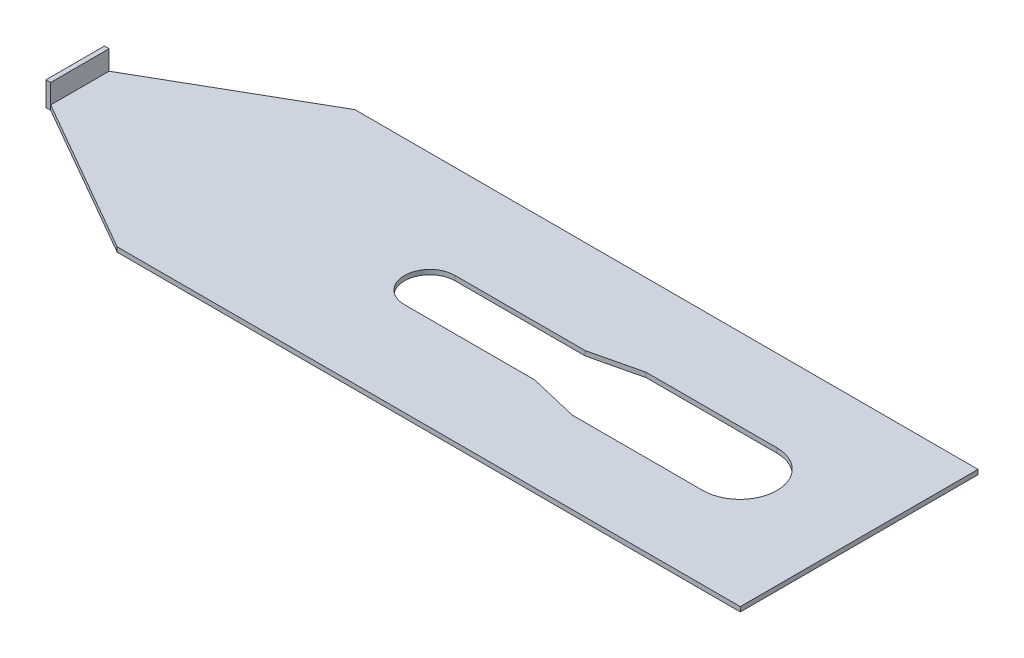
ISO-10303-21;
HEADER;
FILE_DESCRIPTION(('STEP AP214'),'2;1');
FILE_NAME('part.step','',(''),(''),'','','');
FILE_SCHEMA(('AUTOMOTIVE_DESIGN { 1 0 10303 214 1 1 1 1 }'));
ENDSEC;
DATA;
#1=APPLICATION_CONTEXT('core data for automotive mechanical design processes');
#2=APPLICATION_PROTOCOL_DEFINITION('international standard','automotive_design',2000,#1);
#3=PRODUCT_CONTEXT('',#1,'mechanical');
#4=PRODUCT('Part','Part','',(#3));
#5=PRODUCT_RELATED_PRODUCT_CATEGORY('part','',(#4));
#6=PRODUCT_DEFINITION_FORMATION('','',#4);
#7=PRODUCT_DEFINITION_CONTEXT('part definition',#1,'design');
#8=PRODUCT_DEFINITION('design','',#6,#7);
#9=PRODUCT_DEFINITION_SHAPE('','',#8);
#10=(LENGTH_UNIT() NAMED_UNIT(*) SI_UNIT(.MILLI.,.METRE.));
#11=(NAMED_UNIT(*) PLANE_ANGLE_UNIT() SI_UNIT($,.RADIAN.));
#12=(NAMED_UNIT(*) SI_UNIT($,.STERADIAN.) SOLID_ANGLE_UNIT());
#13=UNCERTAINTY_MEASURE_WITH_UNIT(LENGTH_MEASURE(1.E-05),#10,'distance_accuracy_value','');
#14=(GEOMETRIC_REPRESENTATION_CONTEXT(3) GLOBAL_UNCERTAINTY_ASSIGNED_CONTEXT((#13)) GLOBAL_UNIT_ASSIGNED_CONTEXT((#10,
#11,#12)) REPRESENTATION_CONTEXT('',''));
#15=CARTESIAN_POINT('',(0.,0.,0.));
#16=DIRECTION('',(0.,0.,1.));
#17=DIRECTION('',(1.,0.,0.));
#18=AXIS2_PLACEMENT_3D('',#15,#16,#17);
#19=CARTESIAN_POINT('',(0.,0.,4.826));
#20=DIRECTION('',(0.,-1.,0.));
#21=DIRECTION('',(0.,0.,-1.));
#22=AXIS2_PLACEMENT_3D('',#19,#20,#21);
#23=PLANE('',#22);
#24=DIRECTION('',(-1.,0.,0.));
#25=VECTOR('',#24,1.);
#26=CARTESIAN_POINT('',(0.0762,0.,4.826));
#27=LINE('',#26,#25);
#28=CARTESIAN_POINT('',(0.1524,0.,4.826));
#29=VERTEX_POINT('',#28);
#30=CARTESIAN_POINT('',(0.,0.,4.826));
#31=VERTEX_POINT('',#30);
#32=EDGE_CURVE('E187',#29,#31,#27,.T.);
#33=ORIENTED_EDGE('',*,*,#32,.F.);
#34=DIRECTION('',(0.,0.,-1.));
#35=VECTOR('',#34,1.);
#36=CARTESIAN_POINT('',(0.1524,0.,3.8735));
#37=LINE('',#36,#35);
#38=CARTESIAN_POINT('',(0.1524,0.,2.921));
#39=VERTEX_POINT('',#38);
#40=EDGE_CURVE('E77',#29,#39,#37,.T.);
#41=ORIENTED_EDGE('',*,*,#40,.T.);
#42=DIRECTION('',(-1.,0.,0.));
#43=VECTOR('',#42,1.);
#44=CARTESIAN_POINT('',(0.0762,0.,2.921));
#45=LINE('',#44,#43);
#46=CARTESIAN_POINT('',(0.,0.,2.921));
#47=VERTEX_POINT('',#46);
#48=EDGE_CURVE('E180',#39,#47,#45,.T.);
#49=ORIENTED_EDGE('',*,*,#48,.T.);
#50=DIRECTION('',(0.,0.,1.));
#51=VECTOR('',#50,1.);
#52=CARTESIAN_POINT('',(0.,0.,3.8735));
#53=LINE('',#52,#51);
#54=EDGE_CURVE('E173',#47,#31,#53,.T.);
#55=ORIENTED_EDGE('',*,*,#54,.T.);
#56=EDGE_LOOP('',(#33,#41,#49,#55));
#57=FACE_BOUND('',#56,.T.);
#58=ADVANCED_FACE('F16',(#57),#23,.F.);
#59=CARTESIAN_POINT('',(0.1524,0.,2.921));
#60=DIRECTION('',(-1.,0.,0.));
#61=DIRECTION('',(0.,-1.,0.));
#62=AXIS2_PLACEMENT_3D('',#59,#60,#61);
#63=PLANE('',#62);
#64=DIRECTION('',(0.,-1.,0.));
#65=VECTOR('',#64,1.);
#66=CARTESIAN_POINT('',(0.1524,-0.3937,4.826));
#67=LINE('',#66,#65);
#68=CARTESIAN_POINT('',(0.1524,-0.63500000001905,4.826));
#69=VERTEX_POINT('',#68);
#70=EDGE_CURVE('E172',#29,#69,#67,.T.);
#71=ORIENTED_EDGE('',*,*,#70,.T.);
#72=DIRECTION('',(0.,0.,-1.));
#73=VECTOR('',#72,1.);
#74=CARTESIAN_POINT('',(0.1524,-0.635,3.8735));
#75=LINE('',#74,#73);
#76=CARTESIAN_POINT('',(0.1524,-0.63500000001905,2.921));
#77=VERTEX_POINT('',#76);
#78=EDGE_CURVE('E198',#69,#77,#75,.T.);
#79=ORIENTED_EDGE('',*,*,#78,.T.);
#80=DIRECTION('',(0.,1.,0.));
#81=VECTOR('',#80,1.);
#82=CARTESIAN_POINT('',(0.1524,-0.3937,2.921));
#83=LINE('',#82,#81);
#84=EDGE_CURVE('E68',#77,#39,#83,.T.);
#85=ORIENTED_EDGE('',*,*,#84,.T.);
#86=ORIENTED_EDGE('',*,*,#40,.F.);
#87=EDGE_LOOP('',(#71,#79,#85,#86));
#88=FACE_BOUND('',#87,.T.);
#89=ADVANCED_FACE('F336',(#88),#63,.F.);
#90=CARTESIAN_POINT('',(25.5524,-0.7874,0.));
#91=DIRECTION('',(-1.,0.,0.));
#92=DIRECTION('',(0.,0.,1.));
#93=AXIS2_PLACEMENT_3D('',#90,#91,#92);
#94=PLANE('',#93);
#95=DIRECTION('',(0.,0.,1.));
#96=VECTOR('',#95,1.);
#97=CARTESIAN_POINT('',(25.5524,-0.635,3.8735));
#98=LINE('',#97,#96);
#99=CARTESIAN_POINT('',(25.5524,-0.635,0.));
#100=VERTEX_POINT('',#99);
#101=CARTESIAN_POINT('',(25.5524,-0.635,7.747));
#102=VERTEX_POINT('',#101);
#103=EDGE_CURVE('E151',#100,#102,#98,.T.);
#104=ORIENTED_EDGE('',*,*,#103,.T.);
#105=DIRECTION('',(0.,-1.,0.));
#106=VECTOR('',#105,1.);
#107=CARTESIAN_POINT('',(25.5524,-0.7112,7.747));
#108=LINE('',#107,#106);
#109=CARTESIAN_POINT('',(25.5524,-0.7874,7.747));
#110=VERTEX_POINT('',#109);
#111=EDGE_CURVE('E165',#102,#110,#108,.T.);
#112=ORIENTED_EDGE('',*,*,#111,.T.);
#113=DIRECTION('',(0.,0.,-1.));
#114=VECTOR('',#113,1.);
#115=CARTESIAN_POINT('',(25.5524,-0.7874,3.8735));
#116=LINE('',#115,#114);
#117=CARTESIAN_POINT('',(25.5524,-0.7874,0.));
#118=VERTEX_POINT('',#117);
#119=EDGE_CURVE('E221',#110,#118,#116,.T.);
#120=ORIENTED_EDGE('',*,*,#119,.T.);
#121=DIRECTION('',(0.,-1.,0.));
#122=VECTOR('',#121,1.);
#123=CARTESIAN_POINT('',(25.5524,-0.7112,0.));
#124=LINE('',#123,#122);
#125=EDGE_CURVE('E182',#100,#118,#124,.T.);
#126=ORIENTED_EDGE('',*,*,#125,.F.);
#127=EDGE_LOOP('',(#104,#112,#120,#126));
#128=FACE_BOUND('',#127,.T.);
#129=ADVANCED_FACE('F265',(#128),#94,.F.);
#130=CARTESIAN_POINT('',(25.5524,-0.7874,0.));
#131=DIRECTION('',(0.,0.,-1.));
#132=DIRECTION('',(-1.,0.,0.));
#133=AXIS2_PLACEMENT_3D('',#130,#131,#132);
#134=PLANE('',#133);
#135=ORIENTED_EDGE('',*,*,#125,.T.);
#136=DIRECTION('',(-1.,0.,0.));
#137=VECTOR('',#136,1.);
#138=CARTESIAN_POINT('',(12.7762,-0.7874,0.));
#139=LINE('',#138,#137);
#140=CARTESIAN_POINT('',(5.24102865940001,-0.7874,0.));
#141=VERTEX_POINT('',#140);
#142=EDGE_CURVE('E217',#118,#141,#139,.T.);
#143=ORIENTED_EDGE('',*,*,#142,.T.);
#144=DIRECTION('',(0.,1.,0.));
#145=VECTOR('',#144,1.);
#146=CARTESIAN_POINT('',(5.2410286594,-0.7112,0.));
#147=LINE('',#146,#145);
#148=CARTESIAN_POINT('',(5.2410286594,-0.635000000009525,0.));
#149=VERTEX_POINT('',#148);
#150=EDGE_CURVE('E185',#141,#149,#147,.T.);
#151=ORIENTED_EDGE('',*,*,#150,.T.);
#152=DIRECTION('',(1.,0.,0.));
#153=VECTOR('',#152,1.);
#154=CARTESIAN_POINT('',(12.8524,-0.635,0.));
#155=LINE('',#154,#153);
#156=EDGE_CURVE('E206',#149,#100,#155,.T.);
#157=ORIENTED_EDGE('',*,*,#156,.T.);
#158=EDGE_LOOP('',(#135,#143,#151,#157));
#159=FACE_BOUND('',#158,.T.);
#160=ADVANCED_FACE('F279',(#159),#134,.T.);
#161=CARTESIAN_POINT('',(0.1524,-0.7874,2.921));
#162=DIRECTION('',(0.497835498751833,0.,0.867271477786808));
#163=DIRECTION('',(0.867271477786808,0.,-0.497835498751833));
#164=AXIS2_PLACEMENT_3D('',#161,#162,#163);
#165=PLANE('',#164);
#166=DIRECTION('',(0.867271477786808,0.,-0.497835498751833));
#167=VECTOR('',#166,1.);
#168=CARTESIAN_POINT('',(0.1524,-0.7874,2.921));
#169=LINE('',#168,#167);
#170=CARTESIAN_POINT('',(0.152400002212449,-0.7874,2.92099999873));
#171=VERTEX_POINT('',#170);
#172=EDGE_CURVE('E220',#141,#171,#169,.F.);
#173=ORIENTED_EDGE('',*,*,#172,.T.);
#174=DIRECTION('',(0.,1.,0.));
#175=VECTOR('',#174,1.);
#176=CARTESIAN_POINT('',(0.1524,-0.3937,2.921));
#177=LINE('',#176,#175);
#178=EDGE_CURVE('E179',#171,#77,#177,.T.);
#179=ORIENTED_EDGE('',*,*,#178,.T.);
#180=DIRECTION('',(0.867271477786808,0.,-0.497835498751833));
#181=VECTOR('',#180,1.);
#182=CARTESIAN_POINT('',(0.1524,-0.63500000001905,2.921));
#183=LINE('',#182,#181);
#184=EDGE_CURVE('E20',#77,#149,#183,.T.);
#185=ORIENTED_EDGE('',*,*,#184,.T.);
#186=ORIENTED_EDGE('',*,*,#150,.F.);
#187=EDGE_LOOP('',(#173,#179,#185,#186));
#188=FACE_BOUND('',#187,.T.);
#189=ADVANCED_FACE('F283',(#188),#165,.F.);
#190=CARTESIAN_POINT('',(0.,-0.7874,2.921));
#191=DIRECTION('',(0.,0.,1.));
#192=DIRECTION('',(1.,0.,0.));
#193=AXIS2_PLACEMENT_3D('',#190,#191,#192);
#194=PLANE('',#193);
#195=DIRECTION('',(-1.,0.,0.));
#196=VECTOR('',#195,1.);
#197=CARTESIAN_POINT('',(12.7762,-0.7874,2.92099999746));
#198=LINE('',#197,#196);
#199=CARTESIAN_POINT('',(0.,-0.7874,2.920999999365));
#200=VERTEX_POINT('',#199);
#201=EDGE_CURVE('E222',#171,#200,#198,.T.);
#202=ORIENTED_EDGE('',*,*,#201,.T.);
#203=DIRECTION('',(0.,1.,0.));
#204=VECTOR('',#203,1.);
#205=CARTESIAN_POINT('',(0.,-0.3937,2.921));
#206=LINE('',#205,#204);
#207=EDGE_CURVE('E176',#200,#47,#206,.T.);
#208=ORIENTED_EDGE('',*,*,#207,.T.);
#209=ORIENTED_EDGE('',*,*,#48,.F.);
#210=ORIENTED_EDGE('',*,*,#84,.F.);
#211=ORIENTED_EDGE('',*,*,#178,.F.);
#212=EDGE_LOOP('',(#202,#208,#209,#210,#211));
#213=FACE_BOUND('',#212,.T.);
#214=ADVANCED_FACE('F285',(#213),#194,.F.);
#215=CARTESIAN_POINT('',(0.,-0.7874,4.826));
#216=DIRECTION('',(1.,0.,0.));
#217=DIRECTION('',(0.,0.,-1.));
#218=AXIS2_PLACEMENT_3D('',#215,#216,#217);
#219=PLANE('',#218);
#220=DIRECTION('',(0.,1.,0.));
#221=VECTOR('',#220,1.);
#222=CARTESIAN_POINT('',(0.,-0.3937,4.826));
#223=LINE('',#222,#221);
#224=CARTESIAN_POINT('',(0.,-0.7874,4.826000000635));
#225=VERTEX_POINT('',#224);
#226=EDGE_CURVE('E169',#225,#31,#223,.T.);
#227=ORIENTED_EDGE('',*,*,#226,.T.);
#228=ORIENTED_EDGE('',*,*,#54,.F.);
#229=ORIENTED_EDGE('',*,*,#207,.F.);
#230=DIRECTION('',(0.,0.,1.));
#231=VECTOR('',#230,1.);
#232=CARTESIAN_POINT('',(0.,-0.7874,3.8735));
#233=LINE('',#232,#231);
#234=EDGE_CURVE('E213',#200,#225,#233,.T.);
#235=ORIENTED_EDGE('',*,*,#234,.T.);
#236=EDGE_LOOP('',(#227,#228,#229,#235));
#237=FACE_BOUND('',#236,.T.);
#238=ADVANCED_FACE('F348',(#237),#219,.F.);
#239=CARTESIAN_POINT('',(0.1524,-0.7874,4.826));
#240=DIRECTION('',(0.,0.,-1.));
#241=DIRECTION('',(-1.,0.,0.));
#242=AXIS2_PLACEMENT_3D('',#239,#240,#241);
#243=PLANE('',#242);
#244=DIRECTION('',(1.,0.,0.));
#245=VECTOR('',#244,1.);
#246=CARTESIAN_POINT('',(12.7762,-0.7874,4.82600000254));
#247=LINE('',#246,#245);
#248=CARTESIAN_POINT('',(0.152400002212453,-0.7874,4.82600000127));
#249=VERTEX_POINT('',#248);
#250=EDGE_CURVE('E209',#225,#249,#247,.T.);
#251=ORIENTED_EDGE('',*,*,#250,.T.);
#252=DIRECTION('',(0.,1.,0.));
#253=VECTOR('',#252,1.);
#254=CARTESIAN_POINT('',(0.1524,-0.7112,4.826));
#255=LINE('',#254,#253);
#256=EDGE_CURVE('E168',#249,#69,#255,.T.);
#257=ORIENTED_EDGE('',*,*,#256,.T.);
#258=ORIENTED_EDGE('',*,*,#70,.F.);
#259=ORIENTED_EDGE('',*,*,#32,.T.);
#260=ORIENTED_EDGE('',*,*,#226,.F.);
#261=EDGE_LOOP('',(#251,#257,#258,#259,#260));
#262=FACE_BOUND('',#261,.T.);
#263=ADVANCED_FACE('F351',(#262),#243,.F.);
#264=CARTESIAN_POINT('',(5.2410286594,-0.7874,7.747));
#265=DIRECTION('',(0.497835498751833,0.,-0.867271477786808));
#266=DIRECTION('',(-0.867271477786808,0.,-0.497835498751833));
#267=AXIS2_PLACEMENT_3D('',#264,#265,#266);
#268=PLANE('',#267);
#269=DIRECTION('',(-0.867271477786808,0.,-0.497835498751833));
#270=VECTOR('',#269,1.);
#271=CARTESIAN_POINT('',(5.2410286594,-0.7874,7.747));
#272=LINE('',#271,#270);
#273=CARTESIAN_POINT('',(5.2410286594,-0.7874,7.747));
#274=VERTEX_POINT('',#273);
#275=EDGE_CURVE('E212',#249,#274,#272,.F.);
#276=ORIENTED_EDGE('',*,*,#275,.T.);
#277=DIRECTION('',(0.,1.,0.));
#278=VECTOR('',#277,1.);
#279=CARTESIAN_POINT('',(5.2410286594,-0.7112,7.747));
#280=LINE('',#279,#278);
#281=CARTESIAN_POINT('',(5.2410286594,-0.635,7.747));
#282=VERTEX_POINT('',#281);
#283=EDGE_CURVE('E133',#274,#282,#280,.T.);
#284=ORIENTED_EDGE('',*,*,#283,.T.);
#285=DIRECTION('',(-0.867271477786808,0.,-0.497835498751833));
#286=VECTOR('',#285,1.);
#287=CARTESIAN_POINT('',(5.2410286594,-0.635,7.747));
#288=LINE('',#287,#286);
#289=EDGE_CURVE('E194',#282,#69,#288,.T.);
#290=ORIENTED_EDGE('',*,*,#289,.T.);
#291=ORIENTED_EDGE('',*,*,#256,.F.);
#292=EDGE_LOOP('',(#276,#284,#290,#291));
#293=FACE_BOUND('',#292,.T.);
#294=ADVANCED_FACE('F249',(#293),#268,.F.);
#295=CARTESIAN_POINT('',(25.5524,-0.7874,7.747));
#296=DIRECTION('',(0.,0.,-1.));
#297=DIRECTION('',(-1.,0.,0.));
#298=AXIS2_PLACEMENT_3D('',#295,#296,#297);
#299=PLANE('',#298);
#300=ORIENTED_EDGE('',*,*,#283,.F.);
#301=DIRECTION('',(1.,0.,0.));
#302=VECTOR('',#301,1.);
#303=CARTESIAN_POINT('',(12.7762,-0.7874,7.747));
#304=LINE('',#303,#302);
#305=EDGE_CURVE('E214',#274,#110,#304,.T.);
#306=ORIENTED_EDGE('',*,*,#305,.T.);
#307=ORIENTED_EDGE('',*,*,#111,.F.);
#308=DIRECTION('',(-1.,0.,0.));
#309=VECTOR('',#308,1.);
#310=CARTESIAN_POINT('',(12.8524,-0.635,7.747));
#311=LINE('',#310,#309);
#312=EDGE_CURVE('E191',#102,#282,#311,.T.);
#313=ORIENTED_EDGE('',*,*,#312,.T.);
#314=EDGE_LOOP('',(#300,#306,#307,#313));
#315=FACE_BOUND('',#314,.T.);
#316=ADVANCED_FACE('F258',(#315),#299,.F.);
#317=CARTESIAN_POINT('',(15.7983320812,-0.7874,4.699));
#318=DIRECTION('',(-0.230769228017289,0.,0.97300851147372));
#319=DIRECTION('',(0.97300851147372,0.,0.230769228017289));
#320=AXIS2_PLACEMENT_3D('',#317,#318,#319);
#321=PLANE('',#320);
#322=DIRECTION('',(0.97300851147372,0.,0.230769228017289));
#323=VECTOR('',#322,1.);
#324=CARTESIAN_POINT('',(15.7983320812,-0.7874,4.699));
#325=LINE('',#324,#323);
#326=CARTESIAN_POINT('',(17.4047691541387,-0.7874,5.0800000003175));
#327=VERTEX_POINT('',#326);
#328=CARTESIAN_POINT('',(15.7983320812,-0.7874,4.699));
#329=VERTEX_POINT('',#328);
#330=EDGE_CURVE('E127',#327,#329,#325,.F.);
#331=ORIENTED_EDGE('',*,*,#330,.T.);
#332=DIRECTION('',(0.,-1.,0.));
#333=VECTOR('',#332,1.);
#334=CARTESIAN_POINT('',(15.7983320812,-0.7112,4.699));
#335=LINE('',#334,#333);
#336=CARTESIAN_POINT('',(15.7983320812,-0.635,4.699));
#337=VERTEX_POINT('',#336);
#338=EDGE_CURVE('E122',#337,#329,#335,.T.);
#339=ORIENTED_EDGE('',*,*,#338,.F.);
#340=DIRECTION('',(0.97300851147372,0.,0.230769228017289));
#341=VECTOR('',#340,1.);
#342=CARTESIAN_POINT('',(15.7983320812,-0.635,4.699));
#343=LINE('',#342,#341);
#344=CARTESIAN_POINT('',(17.4047691541387,-0.635,5.0800000003175));
#345=VERTEX_POINT('',#344);
#346=EDGE_CURVE('E126',#337,#345,#343,.T.);
#347=ORIENTED_EDGE('',*,*,#346,.T.);
#348=DIRECTION('',(0.,1.,0.));
#349=VECTOR('',#348,1.);
#350=CARTESIAN_POINT('',(17.4047691528,-0.7112,5.08));
#351=LINE('',#350,#349);
#352=EDGE_CURVE('E155',#327,#345,#351,.T.);
#353=ORIENTED_EDGE('',*,*,#352,.F.);
#354=EDGE_LOOP('',(#331,#339,#347,#353));
#355=FACE_BOUND('',#354,.T.);
#356=ADVANCED_FACE('F124',(#355),#321,.F.);
#357=CARTESIAN_POINT('',(11.557,-0.7874,3.048));
#358=DIRECTION('',(0.,0.,1.));
#359=DIRECTION('',(1.,0.,0.));
#360=AXIS2_PLACEMENT_3D('',#357,#358,#359);
#361=PLANE('',#360);
#362=DIRECTION('',(1.,0.,0.));
#363=VECTOR('',#362,1.);
#364=CARTESIAN_POINT('',(12.7762,-0.7874,3.048000000381));
#365=LINE('',#364,#363);
#366=CARTESIAN_POINT('',(11.557,-0.7874,3.0480000001905));
#367=VERTEX_POINT('',#366);
#368=CARTESIAN_POINT('',(15.7983320803968,-0.7874,3.0480000001905));
#369=VERTEX_POINT('',#368);
#370=EDGE_CURVE('E235',#367,#369,#365,.T.);
#371=ORIENTED_EDGE('',*,*,#370,.T.);
#372=DIRECTION('',(0.,-1.,0.));
#373=VECTOR('',#372,1.);
#374=CARTESIAN_POINT('',(15.7983320812,-0.7112,3.048));
#375=LINE('',#374,#373);
#376=CARTESIAN_POINT('',(15.7983320803968,-0.635,3.0480000001905));
#377=VERTEX_POINT('',#376);
#378=EDGE_CURVE('E162',#377,#369,#375,.T.);
#379=ORIENTED_EDGE('',*,*,#378,.F.);
#380=DIRECTION('',(-1.,0.,0.));
#381=VECTOR('',#380,1.);
#382=CARTESIAN_POINT('',(12.8524,-0.635,3.048000000381));
#383=LINE('',#382,#381);
#384=CARTESIAN_POINT('',(11.557,-0.635,3.0480000001905));
#385=VERTEX_POINT('',#384);
#386=EDGE_CURVE('E143',#377,#385,#383,.T.);
#387=ORIENTED_EDGE('',*,*,#386,.T.);
#388=DIRECTION('',(0.,-1.,0.));
#389=VECTOR('',#388,1.);
#390=CARTESIAN_POINT('',(11.557,-0.7112,3.048));
#391=LINE('',#390,#389);
#392=EDGE_CURVE('E132',#385,#367,#391,.T.);
#393=ORIENTED_EDGE('',*,*,#392,.T.);
#394=EDGE_LOOP('',(#371,#379,#387,#393));
#395=FACE_BOUND('',#394,.T.);
#396=ADVANCED_FACE('F323',(#395),#361,.T.);
#397=CARTESIAN_POINT('',(15.7983320812,-0.7874,3.048));
#398=DIRECTION('',(0.230769228017289,0.,0.97300851147372));
#399=DIRECTION('',(0.97300851147372,0.,-0.230769228017289));
#400=AXIS2_PLACEMENT_3D('',#397,#398,#399);
#401=PLANE('',#400);
#402=DIRECTION('',(0.97300851147372,0.,-0.230769228017289));
#403=VECTOR('',#402,1.);
#404=CARTESIAN_POINT('',(15.7983320812,-0.7874,3.048));
#405=LINE('',#404,#403);
#406=CARTESIAN_POINT('',(17.4047691541387,-0.7874,2.6669999996825));
#407=VERTEX_POINT('',#406);
#408=EDGE_CURVE('E232',#369,#407,#405,.T.);
#409=ORIENTED_EDGE('',*,*,#408,.T.);
#410=DIRECTION('',(0.,1.,0.));
#411=VECTOR('',#410,1.);
#412=CARTESIAN_POINT('',(17.4047691528,-0.7112,2.667));
#413=LINE('',#412,#411);
#414=CARTESIAN_POINT('',(17.4047691541387,-0.635,2.6669999996825));
#415=VERTEX_POINT('',#414);
#416=EDGE_CURVE('E160',#407,#415,#413,.T.);
#417=ORIENTED_EDGE('',*,*,#416,.T.);
#418=DIRECTION('',(0.97300851147372,0.,-0.230769228017289));
#419=VECTOR('',#418,1.);
#420=CARTESIAN_POINT('',(15.7983320812,-0.635,3.048));
#421=LINE('',#420,#419);
#422=EDGE_CURVE('E241',#415,#377,#421,.F.);
#423=ORIENTED_EDGE('',*,*,#422,.T.);
#424=ORIENTED_EDGE('',*,*,#378,.T.);
#425=EDGE_LOOP('',(#409,#417,#423,#424));
#426=FACE_BOUND('',#425,.T.);
#427=ADVANCED_FACE('F321',(#426),#401,.T.);
#428=CARTESIAN_POINT('',(21.6662,-0.7874,2.667));
#429=DIRECTION('',(0.,0.,-1.));
#430=DIRECTION('',(-1.,0.,0.));
#431=AXIS2_PLACEMENT_3D('',#428,#429,#430);
#432=PLANE('',#431);
#433=DIRECTION('',(1.,0.,0.));
#434=VECTOR('',#433,1.);
#435=CARTESIAN_POINT('',(12.7762,-0.7874,2.666999999365));
#436=LINE('',#435,#434);
#437=CARTESIAN_POINT('',(21.6662000002321,-0.7874,2.6669999996825));
#438=VERTEX_POINT('',#437);
#439=EDGE_CURVE('E231',#407,#438,#436,.T.);
#440=ORIENTED_EDGE('',*,*,#439,.T.);
#441=DIRECTION('',(0.,1.,0.));
#442=VECTOR('',#441,1.);
#443=CARTESIAN_POINT('',(21.6662000004641,-0.7112,2.667));
#444=LINE('',#443,#442);
#445=CARTESIAN_POINT('',(21.6662000002321,-0.635,2.6669999996825));
#446=VERTEX_POINT('',#445);
#447=EDGE_CURVE('E156',#446,#438,#444,.F.);
#448=ORIENTED_EDGE('',*,*,#447,.F.);
#449=DIRECTION('',(-1.,0.,0.));
#450=VECTOR('',#449,1.);
#451=CARTESIAN_POINT('',(12.8524,-0.635,2.666999999365));
#452=LINE('',#451,#450);
#453=EDGE_CURVE('E244',#446,#415,#452,.T.);
#454=ORIENTED_EDGE('',*,*,#453,.T.);
#455=ORIENTED_EDGE('',*,*,#416,.F.);
#456=EDGE_LOOP('',(#440,#448,#454,#455));
#457=FACE_BOUND('',#456,.T.);
#458=ADVANCED_FACE('F303',(#457),#432,.F.);
#459=CARTESIAN_POINT('',(21.6662,-0.7874,3.8735));
#460=DIRECTION('',(0.,1.,0.));
#461=DIRECTION('',(0.,0.,1.));
#462=AXIS2_PLACEMENT_3D('',#459,#460,#461);
#463=CYLINDRICAL_SURFACE('',#462,1.2065);
#464=DIRECTION('',(0.,-1.,0.));
#465=VECTOR('',#464,1.);
#466=CARTESIAN_POINT('',(21.6662,-0.7112,5.08));
#467=LINE('',#466,#465);
#468=CARTESIAN_POINT('',(21.6662,-0.635,5.0800000003175));
#469=VERTEX_POINT('',#468);
#470=CARTESIAN_POINT('',(21.6662,-0.7874,5.0800000003175));
#471=VERTEX_POINT('',#470);
#472=EDGE_CURVE('E153',#469,#471,#467,.T.);
#473=ORIENTED_EDGE('',*,*,#472,.F.);
#474=CARTESIAN_POINT('',(21.6662,-0.635,3.8735));
#475=DIRECTION('',(0.,1.,0.));
#476=DIRECTION('',(0.,0.,1.));
#477=AXIS2_PLACEMENT_3D('',#474,#475,#476);
#478=CIRCLE('',#477,1.2065);
#479=EDGE_CURVE('E200',#469,#446,#478,.T.);
#480=ORIENTED_EDGE('',*,*,#479,.T.);
#481=ORIENTED_EDGE('',*,*,#447,.T.);
#482=CARTESIAN_POINT('',(21.6662,-0.7874,3.8735));
#483=DIRECTION('',(0.,1.,0.));
#484=DIRECTION('',(0.,0.,1.));
#485=AXIS2_PLACEMENT_3D('',#482,#483,#484);
#486=CIRCLE('',#485,1.2065);
#487=EDGE_CURVE('E228',#438,#471,#486,.F.);
#488=ORIENTED_EDGE('',*,*,#487,.T.);
#489=EDGE_LOOP('',(#473,#480,#481,#488));
#490=FACE_BOUND('',#489,.T.);
#491=ADVANCED_FACE('F309',(#490),#463,.F.);
#492=CARTESIAN_POINT('',(21.6662,-0.7874,5.08));
#493=DIRECTION('',(0.,0.,-1.));
#494=DIRECTION('',(-1.,0.,0.));
#495=AXIS2_PLACEMENT_3D('',#492,#493,#494);
#496=PLANE('',#495);
#497=DIRECTION('',(-1.,0.,0.));
#498=VECTOR('',#497,1.);
#499=CARTESIAN_POINT('',(12.7762,-0.7874,5.080000000635));
#500=LINE('',#499,#498);
#501=EDGE_CURVE('E227',#471,#327,#500,.T.);
#502=ORIENTED_EDGE('',*,*,#501,.T.);
#503=ORIENTED_EDGE('',*,*,#352,.T.);
#504=DIRECTION('',(1.,0.,0.));
#505=VECTOR('',#504,1.);
#506=CARTESIAN_POINT('',(12.8524,-0.635,5.080000000635));
#507=LINE('',#506,#505);
#508=EDGE_CURVE('E142',#345,#469,#507,.T.);
#509=ORIENTED_EDGE('',*,*,#508,.T.);
#510=ORIENTED_EDGE('',*,*,#472,.T.);
#511=EDGE_LOOP('',(#502,#503,#509,#510));
#512=FACE_BOUND('',#511,.T.);
#513=ADVANCED_FACE('F314',(#512),#496,.T.);
#514=CARTESIAN_POINT('',(0.1524,-0.635,0.));
#515=DIRECTION('',(0.,-1.,0.));
#516=DIRECTION('',(1.,0.,0.));
#517=AXIS2_PLACEMENT_3D('',#514,#515,#516);
#518=PLANE('',#517);
#519=ORIENTED_EDGE('',*,*,#346,.F.);
#520=DIRECTION('',(-1.,0.,0.));
#521=VECTOR('',#520,1.);
#522=CARTESIAN_POINT('',(13.6776660406,-0.635,4.699));
#523=LINE('',#522,#521);
#524=CARTESIAN_POINT('',(11.5570000000847,-0.635,4.699));
#525=VERTEX_POINT('',#524);
#526=EDGE_CURVE('E139',#337,#525,#523,.T.);
#527=ORIENTED_EDGE('',*,*,#526,.T.);
#528=CARTESIAN_POINT('',(11.557,-0.635,3.8735));
#529=DIRECTION('',(0.,1.,0.));
#530=DIRECTION('',(0.,0.,1.));
#531=AXIS2_PLACEMENT_3D('',#528,#529,#530);
#532=CIRCLE('',#531,0.8255);
#533=EDGE_CURVE('E34',#385,#525,#532,.T.);
#534=ORIENTED_EDGE('',*,*,#533,.F.);
#535=ORIENTED_EDGE('',*,*,#386,.F.);
#536=ORIENTED_EDGE('',*,*,#422,.F.);
#537=ORIENTED_EDGE('',*,*,#453,.F.);
#538=ORIENTED_EDGE('',*,*,#479,.F.);
#539=ORIENTED_EDGE('',*,*,#508,.F.);
#540=EDGE_LOOP('',(#519,#527,#534,#535,#536,#537,#538,#539));
#541=FACE_BOUND('',#540,.T.);
#542=ORIENTED_EDGE('',*,*,#289,.F.);
#543=ORIENTED_EDGE('',*,*,#312,.F.);
#544=ORIENTED_EDGE('',*,*,#103,.F.);
#545=ORIENTED_EDGE('',*,*,#156,.F.);
#546=ORIENTED_EDGE('',*,*,#184,.F.);
#547=ORIENTED_EDGE('',*,*,#78,.F.);
#548=EDGE_LOOP('',(#542,#543,#544,#545,#546,#547));
#549=FACE_BOUND('',#548,.T.);
#550=ADVANCED_FACE('F137',(#541,#549),#518,.F.);
#551=CARTESIAN_POINT('',(25.5524,-0.7874,0.));
#552=DIRECTION('',(0.,1.,0.));
#553=DIRECTION('',(-1.,0.,0.));
#554=AXIS2_PLACEMENT_3D('',#551,#552,#553);
#555=PLANE('',#554);
#556=ORIENTED_EDGE('',*,*,#487,.F.);
#557=ORIENTED_EDGE('',*,*,#439,.F.);
#558=ORIENTED_EDGE('',*,*,#408,.F.);
#559=ORIENTED_EDGE('',*,*,#370,.F.);
#560=CARTESIAN_POINT('',(11.557,-0.7874,3.8735));
#561=DIRECTION('',(0.,1.,0.));
#562=DIRECTION('',(0.,0.,1.));
#563=AXIS2_PLACEMENT_3D('',#560,#561,#562);
#564=CIRCLE('',#563,0.8255);
#565=CARTESIAN_POINT('',(11.5570000000847,-0.7874,4.699));
#566=VERTEX_POINT('',#565);
#567=EDGE_CURVE('E147',#566,#367,#564,.F.);
#568=ORIENTED_EDGE('',*,*,#567,.F.);
#569=DIRECTION('',(1.,0.,0.));
#570=VECTOR('',#569,1.);
#571=CARTESIAN_POINT('',(13.6776660406,-0.7874,4.699));
#572=LINE('',#571,#570);
#573=EDGE_CURVE('E26',#566,#329,#572,.T.);
#574=ORIENTED_EDGE('',*,*,#573,.T.);
#575=ORIENTED_EDGE('',*,*,#330,.F.);
#576=ORIENTED_EDGE('',*,*,#501,.F.);
#577=EDGE_LOOP('',(#556,#557,#558,#559,#568,#574,#575,#576));
#578=FACE_BOUND('',#577,.T.);
#579=ORIENTED_EDGE('',*,*,#275,.F.);
#580=ORIENTED_EDGE('',*,*,#250,.F.);
#581=ORIENTED_EDGE('',*,*,#234,.F.);
#582=ORIENTED_EDGE('',*,*,#201,.F.);
#583=ORIENTED_EDGE('',*,*,#172,.F.);
#584=ORIENTED_EDGE('',*,*,#142,.F.);
#585=ORIENTED_EDGE('',*,*,#119,.F.);
#586=ORIENTED_EDGE('',*,*,#305,.F.);
#587=EDGE_LOOP('',(#579,#580,#581,#582,#583,#584,#585,#586));
#588=FACE_BOUND('',#587,.T.);
#589=ADVANCED_FACE('F287',(#578,#588),#555,.F.);
#590=CARTESIAN_POINT('',(11.557,-0.7874,4.699));
#591=DIRECTION('',(0.,0.,1.));
#592=DIRECTION('',(1.,0.,0.));
#593=AXIS2_PLACEMENT_3D('',#590,#591,#592);
#594=PLANE('',#593);
#595=ORIENTED_EDGE('',*,*,#573,.F.);
#596=DIRECTION('',(0.,1.,0.));
#597=VECTOR('',#596,1.);
#598=CARTESIAN_POINT('',(11.5570000001693,-0.7112,4.699));
#599=LINE('',#598,#597);
#600=EDGE_CURVE('E11',#525,#566,#599,.F.);
#601=ORIENTED_EDGE('',*,*,#600,.F.);
#602=ORIENTED_EDGE('',*,*,#526,.F.);
#603=ORIENTED_EDGE('',*,*,#338,.T.);
#604=EDGE_LOOP('',(#595,#601,#602,#603));
#605=FACE_BOUND('',#604,.T.);
#606=ADVANCED_FACE('F18',(#605),#594,.F.);
#607=CARTESIAN_POINT('',(11.557,-0.7874,3.8735));
#608=DIRECTION('',(0.,1.,0.));
#609=DIRECTION('',(0.,0.,1.));
#610=AXIS2_PLACEMENT_3D('',#607,#608,#609);
#611=CYLINDRICAL_SURFACE('',#610,0.8255);
#612=ORIENTED_EDGE('',*,*,#533,.T.);
#613=ORIENTED_EDGE('',*,*,#600,.T.);
#614=ORIENTED_EDGE('',*,*,#567,.T.);
#615=ORIENTED_EDGE('',*,*,#392,.F.);
#616=EDGE_LOOP('',(#612,#613,#614,#615));
#617=FACE_BOUND('',#616,.T.);
#618=ADVANCED_FACE('F324',(#617),#611,.F.);
#619=CLOSED_SHELL('',(#58,#89,#129,#160,#189,#214,#238,#263,#294,#316,#356,#396,#427,#458,#491,
#513,#550,#589,#606,#618));
#620=MANIFOLD_SOLID_BREP('B1',#619);
#621=ADVANCED_BREP_SHAPE_REPRESENTATION('',(#18,#620),#14);
#622=SHAPE_DEFINITION_REPRESENTATION(#9,#621);
ENDSEC;
END-ISO-10303-21;
